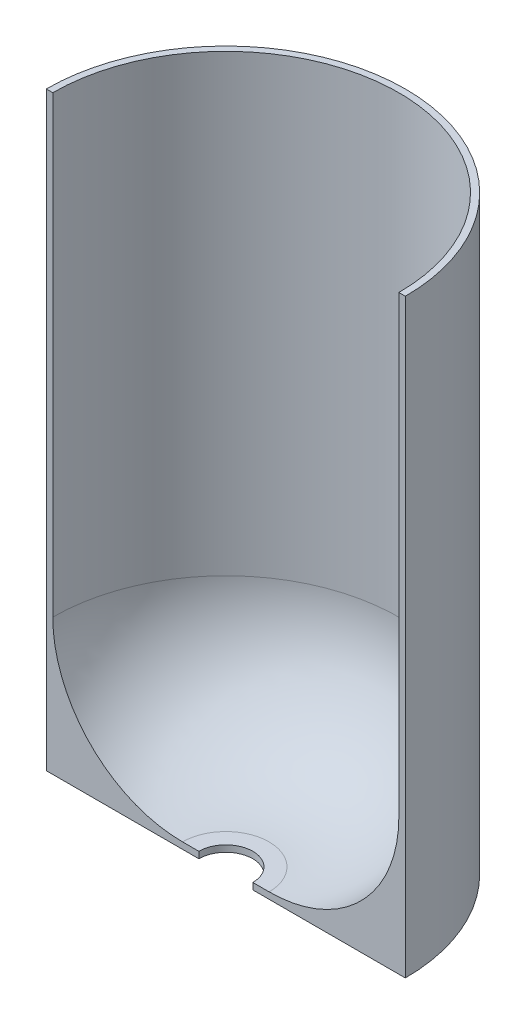
ISO-10303-21;
HEADER;
FILE_DESCRIPTION(('STEP AP214'),'2;1');
FILE_NAME('part.step','',(''),(''),'','','');
FILE_SCHEMA(('AUTOMOTIVE_DESIGN { 1 0 10303 214 1 1 1 1 }'));
ENDSEC;
DATA;
#1=APPLICATION_CONTEXT('core data for automotive mechanical design processes');
#2=APPLICATION_PROTOCOL_DEFINITION('international standard','automotive_design',2000,#1);
#3=PRODUCT_CONTEXT('',#1,'mechanical');
#4=PRODUCT('Part','Part','',(#3));
#5=PRODUCT_RELATED_PRODUCT_CATEGORY('part','',(#4));
#6=PRODUCT_DEFINITION_FORMATION('','',#4);
#7=PRODUCT_DEFINITION_CONTEXT('part definition',#1,'design');
#8=PRODUCT_DEFINITION('design','',#6,#7);
#9=PRODUCT_DEFINITION_SHAPE('','',#8);
#10=(LENGTH_UNIT() NAMED_UNIT(*) SI_UNIT(.MILLI.,.METRE.));
#11=(NAMED_UNIT(*) PLANE_ANGLE_UNIT() SI_UNIT($,.RADIAN.));
#12=(NAMED_UNIT(*) SI_UNIT($,.STERADIAN.) SOLID_ANGLE_UNIT());
#13=UNCERTAINTY_MEASURE_WITH_UNIT(LENGTH_MEASURE(1.E-05),#10,'distance_accuracy_value','');
#14=(GEOMETRIC_REPRESENTATION_CONTEXT(3) GLOBAL_UNCERTAINTY_ASSIGNED_CONTEXT((#13)) GLOBAL_UNIT_ASSIGNED_CONTEXT((#10,
#11,#12)) REPRESENTATION_CONTEXT('',''));
#15=CARTESIAN_POINT('',(0.,0.,0.));
#16=DIRECTION('',(0.,0.,1.));
#17=DIRECTION('',(1.,0.,0.));
#18=AXIS2_PLACEMENT_3D('',#15,#16,#17);
#19=CARTESIAN_POINT('',(0.,0.,0.));
#20=DIRECTION('',(0.,0.,1.));
#21=DIRECTION('',(1.,0.,0.));
#22=AXIS2_PLACEMENT_3D('',#19,#20,#21);
#23=PLANE('',#22);
#24=DIRECTION('',(0.,1.,0.));
#25=VECTOR('',#24,1.);
#26=CARTESIAN_POINT('',(4.16024761703483,-10.,0.));
#27=LINE('',#26,#25);
#28=CARTESIAN_POINT('',(4.16024761703483,-0.999999999999999,0.));
#29=VERTEX_POINT('',#28);
#30=CARTESIAN_POINT('',(4.16024761703483,0.,0.));
#31=VERTEX_POINT('',#30);
#32=EDGE_CURVE('E50',#29,#31,#27,.T.);
#33=ORIENTED_EDGE('',*,*,#32,.F.);
#34=DIRECTION('',(1.,0.,0.));
#35=VECTOR('',#34,1.);
#36=CARTESIAN_POINT('',(0.,-1.,0.));
#37=LINE('',#36,#35);
#38=CARTESIAN_POINT('',(27.67,-1.,0.));
#39=VERTEX_POINT('',#38);
#40=EDGE_CURVE('E136',#29,#39,#37,.T.);
#41=ORIENTED_EDGE('',*,*,#40,.T.);
#42=DIRECTION('',(0.,-1.,0.));
#43=VECTOR('',#42,1.);
#44=CARTESIAN_POINT('',(27.67,90.,0.));
#45=LINE('',#44,#43);
#46=CARTESIAN_POINT('',(27.67,90.,0.));
#47=VERTEX_POINT('',#46);
#48=EDGE_CURVE('E133',#39,#47,#45,.F.);
#49=ORIENTED_EDGE('',*,*,#48,.T.);
#50=DIRECTION('',(1.,0.,0.));
#51=VECTOR('',#50,1.);
#52=CARTESIAN_POINT('',(0.,90.,0.));
#53=LINE('',#52,#51);
#54=CARTESIAN_POINT('',(26.67,90.,0.));
#55=VERTEX_POINT('',#54);
#56=EDGE_CURVE('E127',#55,#47,#53,.T.);
#57=ORIENTED_EDGE('',*,*,#56,.F.);
#58=DIRECTION('',(0.,-1.,0.));
#59=VECTOR('',#58,1.);
#60=CARTESIAN_POINT('',(26.67,90.,0.));
#61=LINE('',#60,#59);
#62=CARTESIAN_POINT('',(26.67,19.9999999999999,0.));
#63=VERTEX_POINT('',#62);
#64=EDGE_CURVE('E121',#63,#55,#61,.F.);
#65=ORIENTED_EDGE('',*,*,#64,.F.);
#66=CARTESIAN_POINT('',(6.67,20.,0.));
#67=DIRECTION('',(0.,0.,1.));
#68=DIRECTION('',(1.,0.,0.));
#69=AXIS2_PLACEMENT_3D('',#66,#67,#68);
#70=CIRCLE('',#69,20.);
#71=CARTESIAN_POINT('',(6.67,0.,0.));
#72=VERTEX_POINT('',#71);
#73=EDGE_CURVE('E12',#63,#72,#70,.F.);
#74=ORIENTED_EDGE('',*,*,#73,.T.);
#75=DIRECTION('',(1.,0.,0.));
#76=VECTOR('',#75,1.);
#77=CARTESIAN_POINT('',(0.,0.,0.));
#78=LINE('',#77,#76);
#79=EDGE_CURVE('E116',#31,#72,#78,.T.);
#80=ORIENTED_EDGE('',*,*,#79,.F.);
#81=EDGE_LOOP('',(#33,#41,#49,#57,#65,#74,#80));
#82=FACE_BOUND('',#81,.T.);
#83=ADVANCED_FACE('F35',(#82),#23,.T.);
#84=DIRECTION('',(0.,1.,0.));
#85=VECTOR('',#84,1.);
#86=CARTESIAN_POINT('',(-4.16024761703483,-10.,0.));
#87=LINE('',#86,#85);
#88=CARTESIAN_POINT('',(-4.16024761703483,0.,0.));
#89=VERTEX_POINT('',#88);
#90=CARTESIAN_POINT('',(-4.16024761703483,-0.999999999999999,0.));
#91=VERTEX_POINT('',#90);
#92=EDGE_CURVE('E95',#89,#91,#87,.F.);
#93=ORIENTED_EDGE('',*,*,#92,.F.);
#94=CARTESIAN_POINT('',(-6.67,0.,0.));
#95=VERTEX_POINT('',#94);
#96=EDGE_CURVE('E106',#95,#89,#78,.T.);
#97=ORIENTED_EDGE('',*,*,#96,.F.);
#98=CARTESIAN_POINT('',(-6.67,20.,0.));
#99=DIRECTION('',(0.,0.,1.));
#100=DIRECTION('',(1.,0.,0.));
#101=AXIS2_PLACEMENT_3D('',#98,#99,#100);
#102=CIRCLE('',#101,20.);
#103=CARTESIAN_POINT('',(-26.67,19.9999999999999,0.));
#104=VERTEX_POINT('',#103);
#105=EDGE_CURVE('E43',#95,#104,#102,.F.);
#106=ORIENTED_EDGE('',*,*,#105,.T.);
#107=DIRECTION('',(0.,-1.,0.));
#108=VECTOR('',#107,1.);
#109=CARTESIAN_POINT('',(-26.67,90.,0.));
#110=LINE('',#109,#108);
#111=CARTESIAN_POINT('',(-26.67,90.,0.));
#112=VERTEX_POINT('',#111);
#113=EDGE_CURVE('E125',#112,#104,#110,.T.);
#114=ORIENTED_EDGE('',*,*,#113,.F.);
#115=CARTESIAN_POINT('',(-27.67,90.,0.));
#116=VERTEX_POINT('',#115);
#117=EDGE_CURVE('E128',#116,#112,#53,.T.);
#118=ORIENTED_EDGE('',*,*,#117,.F.);
#119=DIRECTION('',(0.,-1.,0.));
#120=VECTOR('',#119,1.);
#121=CARTESIAN_POINT('',(-27.67,90.,0.));
#122=LINE('',#121,#120);
#123=CARTESIAN_POINT('',(-27.67,-1.,0.));
#124=VERTEX_POINT('',#123);
#125=EDGE_CURVE('E131',#116,#124,#122,.T.);
#126=ORIENTED_EDGE('',*,*,#125,.T.);
#127=EDGE_CURVE('E109',#124,#91,#37,.T.);
#128=ORIENTED_EDGE('',*,*,#127,.T.);
#129=EDGE_LOOP('',(#93,#97,#106,#114,#118,#126,#128));
#130=FACE_BOUND('',#129,.T.);
#131=ADVANCED_FACE('F105',(#130),#23,.T.);
#132=CARTESIAN_POINT('',(0.,90.,0.));
#133=DIRECTION('',(0.,-1.,0.));
#134=DIRECTION('',(0.,0.,-1.));
#135=AXIS2_PLACEMENT_3D('',#132,#133,#134);
#136=CYLINDRICAL_SURFACE('',#135,27.67);
#137=ORIENTED_EDGE('',*,*,#125,.F.);
#138=CARTESIAN_POINT('',(0.,90.,0.));
#139=DIRECTION('',(0.,1.,0.));
#140=DIRECTION('',(0.,0.,1.));
#141=AXIS2_PLACEMENT_3D('',#138,#139,#140);
#142=CIRCLE('',#141,27.67);
#143=EDGE_CURVE('E115',#47,#116,#142,.T.);
#144=ORIENTED_EDGE('',*,*,#143,.F.);
#145=ORIENTED_EDGE('',*,*,#48,.F.);
#146=CARTESIAN_POINT('',(0.,-1.,0.));
#147=DIRECTION('',(0.,1.,0.));
#148=DIRECTION('',(0.,0.,1.));
#149=AXIS2_PLACEMENT_3D('',#146,#147,#148);
#150=CIRCLE('',#149,27.67);
#151=EDGE_CURVE('E119',#39,#124,#150,.T.);
#152=ORIENTED_EDGE('',*,*,#151,.T.);
#153=EDGE_LOOP('',(#137,#144,#145,#152));
#154=FACE_BOUND('',#153,.T.);
#155=ADVANCED_FACE('F155',(#154),#136,.T.);
#156=CARTESIAN_POINT('',(0.,-1.,0.));
#157=DIRECTION('',(0.,1.,0.));
#158=DIRECTION('',(0.,0.,1.));
#159=AXIS2_PLACEMENT_3D('',#156,#157,#158);
#160=PLANE('',#159);
#161=ORIENTED_EDGE('',*,*,#40,.F.);
#162=CARTESIAN_POINT('',(0.,-0.999999999999999,0.));
#163=DIRECTION('',(0.,1.,0.));
#164=DIRECTION('',(0.,0.,1.));
#165=AXIS2_PLACEMENT_3D('',#162,#163,#164);
#166=CIRCLE('',#165,4.16024761703483);
#167=EDGE_CURVE('E100',#29,#91,#166,.T.);
#168=ORIENTED_EDGE('',*,*,#167,.T.);
#169=ORIENTED_EDGE('',*,*,#127,.F.);
#170=ORIENTED_EDGE('',*,*,#151,.F.);
#171=EDGE_LOOP('',(#161,#168,#169,#170));
#172=FACE_BOUND('',#171,.T.);
#173=ADVANCED_FACE('F159',(#172),#160,.F.);
#174=CARTESIAN_POINT('',(0.,90.,0.));
#175=DIRECTION('',(0.,1.,0.));
#176=DIRECTION('',(0.,0.,1.));
#177=AXIS2_PLACEMENT_3D('',#174,#175,#176);
#178=PLANE('',#177);
#179=ORIENTED_EDGE('',*,*,#143,.T.);
#180=ORIENTED_EDGE('',*,*,#117,.T.);
#181=CARTESIAN_POINT('',(0.,90.,0.));
#182=DIRECTION('',(0.,1.,0.));
#183=DIRECTION('',(0.,0.,1.));
#184=AXIS2_PLACEMENT_3D('',#181,#182,#183);
#185=CIRCLE('',#184,26.67);
#186=EDGE_CURVE('E139',#55,#112,#185,.T.);
#187=ORIENTED_EDGE('',*,*,#186,.F.);
#188=ORIENTED_EDGE('',*,*,#56,.T.);
#189=EDGE_LOOP('',(#179,#180,#187,#188));
#190=FACE_BOUND('',#189,.T.);
#191=ADVANCED_FACE('F152',(#190),#178,.T.);
#192=CARTESIAN_POINT('',(0.,90.,0.));
#193=DIRECTION('',(0.,-1.,0.));
#194=DIRECTION('',(0.,0.,-1.));
#195=AXIS2_PLACEMENT_3D('',#192,#193,#194);
#196=CYLINDRICAL_SURFACE('',#195,26.67);
#197=ORIENTED_EDGE('',*,*,#113,.T.);
#198=CARTESIAN_POINT('',(0.,19.9999999999999,0.));
#199=DIRECTION('',(0.,1.,0.));
#200=DIRECTION('',(0.,0.,1.));
#201=AXIS2_PLACEMENT_3D('',#198,#199,#200);
#202=CIRCLE('',#201,26.67);
#203=EDGE_CURVE('E58',#104,#63,#202,.F.);
#204=ORIENTED_EDGE('',*,*,#203,.T.);
#205=ORIENTED_EDGE('',*,*,#64,.T.);
#206=ORIENTED_EDGE('',*,*,#186,.T.);
#207=EDGE_LOOP('',(#197,#204,#205,#206));
#208=FACE_BOUND('',#207,.T.);
#209=ADVANCED_FACE('F144',(#208),#196,.F.);
#210=CARTESIAN_POINT('',(0.,0.,0.));
#211=DIRECTION('',(0.,1.,0.));
#212=DIRECTION('',(0.,0.,1.));
#213=AXIS2_PLACEMENT_3D('',#210,#211,#212);
#214=PLANE('',#213);
#215=CARTESIAN_POINT('',(0.,0.,0.));
#216=DIRECTION('',(0.,1.,0.));
#217=DIRECTION('',(0.,0.,1.));
#218=AXIS2_PLACEMENT_3D('',#215,#216,#217);
#219=CIRCLE('',#218,4.16024761703483);
#220=EDGE_CURVE('E92',#31,#89,#219,.T.);
#221=ORIENTED_EDGE('',*,*,#220,.F.);
#222=ORIENTED_EDGE('',*,*,#79,.T.);
#223=CARTESIAN_POINT('',(0.,0.,0.));
#224=DIRECTION('',(0.,1.,0.));
#225=DIRECTION('',(0.,0.,1.));
#226=AXIS2_PLACEMENT_3D('',#223,#224,#225);
#227=CIRCLE('',#226,6.67);
#228=EDGE_CURVE('E114',#72,#95,#227,.T.);
#229=ORIENTED_EDGE('',*,*,#228,.T.);
#230=ORIENTED_EDGE('',*,*,#96,.T.);
#231=EDGE_LOOP('',(#221,#222,#229,#230));
#232=FACE_BOUND('',#231,.T.);
#233=ADVANCED_FACE('F112',(#232),#214,.T.);
#234=CARTESIAN_POINT('',(0.,20.,0.));
#235=DIRECTION('',(0.,1.,0.));
#236=DIRECTION('',(0.,0.,1.));
#237=AXIS2_PLACEMENT_3D('',#234,#235,#236);
#238=DEGENERATE_TOROIDAL_SURFACE('',#237,6.67,20.,.T.);
#239=ORIENTED_EDGE('',*,*,#73,.F.);
#240=ORIENTED_EDGE('',*,*,#203,.F.);
#241=ORIENTED_EDGE('',*,*,#105,.F.);
#242=ORIENTED_EDGE('',*,*,#228,.F.);
#243=EDGE_LOOP('',(#239,#240,#241,#242));
#244=FACE_BOUND('',#243,.T.);
#245=ADVANCED_FACE('F37',(#244),#238,.F.);
#246=CARTESIAN_POINT('',(0.,-10.,0.));
#247=DIRECTION('',(0.,1.,0.));
#248=DIRECTION('',(0.,0.,1.));
#249=AXIS2_PLACEMENT_3D('',#246,#247,#248);
#250=CYLINDRICAL_SURFACE('',#249,4.16024761703483);
#251=ORIENTED_EDGE('',*,*,#32,.T.);
#252=ORIENTED_EDGE('',*,*,#220,.T.);
#253=ORIENTED_EDGE('',*,*,#92,.T.);
#254=ORIENTED_EDGE('',*,*,#167,.F.);
#255=EDGE_LOOP('',(#251,#252,#253,#254));
#256=FACE_BOUND('',#255,.T.);
#257=ADVANCED_FACE('F94',(#256),#250,.F.);
#258=CLOSED_SHELL('',(#83,#131,#155,#173,#191,#209,#233,#245,#257));
#259=MANIFOLD_SOLID_BREP('B2',#258);
#260=ADVANCED_BREP_SHAPE_REPRESENTATION('',(#18,#259),#14);
#261=SHAPE_DEFINITION_REPRESENTATION(#9,#260);
ENDSEC;
END-ISO-10303-21;
